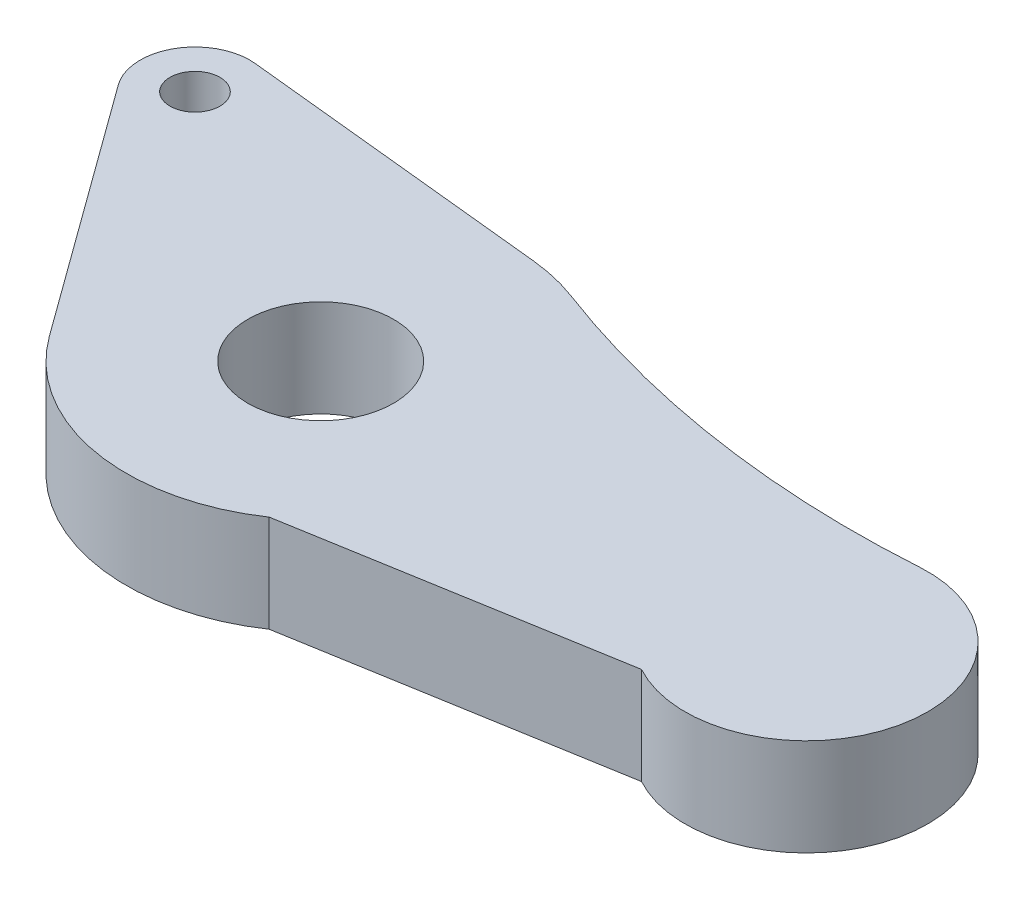
ISO-10303-21;
HEADER;
FILE_DESCRIPTION(('STEP AP214'),'2;1');
FILE_NAME('part.step','',(''),(''),'','','');
FILE_SCHEMA(('AUTOMOTIVE_DESIGN { 1 0 10303 214 1 1 1 1 }'));
ENDSEC;
DATA;
#1=APPLICATION_CONTEXT('core data for automotive mechanical design processes');
#2=APPLICATION_PROTOCOL_DEFINITION('international standard','automotive_design',2000,#1);
#3=PRODUCT_CONTEXT('',#1,'mechanical');
#4=PRODUCT('Part','Part','',(#3));
#5=PRODUCT_RELATED_PRODUCT_CATEGORY('part','',(#4));
#6=PRODUCT_DEFINITION_FORMATION('','',#4);
#7=PRODUCT_DEFINITION_CONTEXT('part definition',#1,'design');
#8=PRODUCT_DEFINITION('design','',#6,#7);
#9=PRODUCT_DEFINITION_SHAPE('','',#8);
#10=(LENGTH_UNIT() NAMED_UNIT(*) SI_UNIT(.MILLI.,.METRE.));
#11=(NAMED_UNIT(*) PLANE_ANGLE_UNIT() SI_UNIT($,.RADIAN.));
#12=(NAMED_UNIT(*) SI_UNIT($,.STERADIAN.) SOLID_ANGLE_UNIT());
#13=UNCERTAINTY_MEASURE_WITH_UNIT(LENGTH_MEASURE(1.E-05),#10,'distance_accuracy_value','');
#14=(GEOMETRIC_REPRESENTATION_CONTEXT(3) GLOBAL_UNCERTAINTY_ASSIGNED_CONTEXT((#13)) GLOBAL_UNIT_ASSIGNED_CONTEXT((#10,
#11,#12)) REPRESENTATION_CONTEXT('',''));
#15=CARTESIAN_POINT('',(0.,0.,0.));
#16=DIRECTION('',(0.,0.,1.));
#17=DIRECTION('',(1.,0.,0.));
#18=AXIS2_PLACEMENT_3D('',#15,#16,#17);
#19=CARTESIAN_POINT('',(0.,2.,0.));
#20=DIRECTION('',(0.,-1.,0.));
#21=DIRECTION('',(0.,0.,-1.));
#22=AXIS2_PLACEMENT_3D('',#19,#20,#21);
#23=CYLINDRICAL_SURFACE('',#22,4.);
#24=DIRECTION('',(0.,1.,0.));
#25=VECTOR('',#24,1.);
#26=CARTESIAN_POINT('',(0.408466300966631,-10.3550195170832,-3.97908975533031));
#27=LINE('',#26,#25);
#28=CARTESIAN_POINT('',(0.40846630096663,0.,-3.97908975533031));
#29=VERTEX_POINT('',#28);
#30=CARTESIAN_POINT('',(0.408466300966631,2.,-3.97908975533031));
#31=VERTEX_POINT('',#30);
#32=EDGE_CURVE('E56',#29,#31,#27,.T.);
#33=ORIENTED_EDGE('',*,*,#32,.T.);
#34=CARTESIAN_POINT('',(0.,2.,0.));
#35=DIRECTION('',(0.,1.,0.));
#36=DIRECTION('',(0.,0.,1.));
#37=AXIS2_PLACEMENT_3D('',#34,#35,#36);
#38=CIRCLE('',#37,4.);
#39=CARTESIAN_POINT('',(1.41458333333333,2.,-3.74151760560545));
#40=VERTEX_POINT('',#39);
#41=EDGE_CURVE('E145',#40,#31,#38,.T.);
#42=ORIENTED_EDGE('',*,*,#41,.F.);
#43=DIRECTION('',(0.,-1.,0.));
#44=VECTOR('',#43,1.);
#45=CARTESIAN_POINT('',(1.41458333333333,2.,-3.74151760560545));
#46=LINE('',#45,#44);
#47=CARTESIAN_POINT('',(1.41458333333333,0.,-3.74151760560545));
#48=VERTEX_POINT('',#47);
#49=EDGE_CURVE('E153',#40,#48,#46,.T.);
#50=ORIENTED_EDGE('',*,*,#49,.T.);
#51=CARTESIAN_POINT('',(0.,0.,0.));
#52=DIRECTION('',(0.,1.,0.));
#53=DIRECTION('',(0.,0.,1.));
#54=AXIS2_PLACEMENT_3D('',#51,#52,#53);
#55=CIRCLE('',#54,4.);
#56=EDGE_CURVE('E154',#48,#29,#55,.T.);
#57=ORIENTED_EDGE('',*,*,#56,.T.);
#58=EDGE_LOOP('',(#33,#42,#50,#57));
#59=FACE_BOUND('',#58,.T.);
#60=ADVANCED_FACE('F33',(#59),#23,.T.);
#61=CARTESIAN_POINT('',(0.,2.,0.));
#62=DIRECTION('',(0.,1.,0.));
#63=DIRECTION('',(0.,0.,1.));
#64=AXIS2_PLACEMENT_3D('',#61,#62,#63);
#65=PLANE('',#64);
#66=ORIENTED_EDGE('',*,*,#41,.T.);
#67=DIRECTION('',(-0.994772438832578,0.,-0.102116575241658));
#68=VECTOR('',#67,1.);
#69=CARTESIAN_POINT('',(-5.98414407196677,2.,-4.63531167368618));
#70=LINE('',#69,#68);
#71=CARTESIAN_POINT('',(-5.98414407196677,2.,-4.63531167368618));
#72=VERTEX_POINT('',#71);
#73=EDGE_CURVE('E112',#31,#72,#70,.T.);
#74=ORIENTED_EDGE('',*,*,#73,.T.);
#75=CARTESIAN_POINT('',(-6.09949561710737,2.,-3.51161028034161));
#76=DIRECTION('',(0.,1.,0.));
#77=DIRECTION('',(0.,0.,1.));
#78=AXIS2_PLACEMENT_3D('',#75,#76,#77);
#79=CIRCLE('',#78,1.12960648031553);
#80=CARTESIAN_POINT('',(-7.01335309100463,2.,-2.8476258544904));
#81=VERTEX_POINT('',#80);
#82=EDGE_CURVE('E106',#72,#81,#79,.T.);
#83=ORIENTED_EDGE('',*,*,#82,.T.);
#84=DIRECTION('',(0.587801537457314,0.,0.809005162259684));
#85=VECTOR('',#84,1.);
#86=CARTESIAN_POINT('',(-7.01335309100463,2.,-2.8476258544904));
#87=LINE('',#86,#85);
#88=CARTESIAN_POINT('',(-3.23602064903874,2.,2.35120614982926));
#89=VERTEX_POINT('',#88);
#90=EDGE_CURVE('E115',#81,#89,#87,.T.);
#91=ORIENTED_EDGE('',*,*,#90,.T.);
#92=CARTESIAN_POINT('',(2.24792213296292,2.,3.30860183221485));
#93=VERTEX_POINT('',#92);
#94=EDGE_CURVE('E48',#89,#93,#38,.T.);
#95=ORIENTED_EDGE('',*,*,#94,.T.);
#96=DIRECTION('',(0.985747988526401,0.,-0.168228722625341));
#97=VECTOR('',#96,1.);
#98=CARTESIAN_POINT('',(2.24792213296292,2.,3.30860183221485));
#99=LINE('',#98,#97);
#100=CARTESIAN_POINT('',(8.79617017612445,2.,2.19107137153215));
#101=VERTEX_POINT('',#100);
#102=EDGE_CURVE('E147',#93,#101,#99,.T.);
#103=ORIENTED_EDGE('',*,*,#102,.T.);
#104=CARTESIAN_POINT('',(10.,2.,0.));
#105=DIRECTION('',(0.,1.,0.));
#106=DIRECTION('',(0.,0.,1.));
#107=AXIS2_PLACEMENT_3D('',#104,#105,#106);
#108=CIRCLE('',#107,2.5);
#109=CARTESIAN_POINT('',(9.83194444444445,2.,-2.49434507040364));
#110=VERTEX_POINT('',#109);
#111=EDGE_CURVE('E149',#101,#110,#108,.T.);
#112=ORIENTED_EDGE('',*,*,#111,.T.);
#113=CARTESIAN_POINT('',(8.4875,2.,-22.4491056336327));
#114=DIRECTION('',(0.,-1.,0.));
#115=DIRECTION('',(0.,0.,1.));
#116=AXIS2_PLACEMENT_3D('',#113,#114,#115);
#117=CIRCLE('',#116,20.);
#118=EDGE_CURVE('E151',#110,#40,#117,.T.);
#119=ORIENTED_EDGE('',*,*,#118,.T.);
#120=EDGE_LOOP('',(#66,#74,#83,#91,#95,#103,#112,#119));
#121=FACE_BOUND('',#120,.T.);
#122=CARTESIAN_POINT('',(0.,2.,0.));
#123=DIRECTION('',(0.,1.,0.));
#124=DIRECTION('',(0.,0.,1.));
#125=AXIS2_PLACEMENT_3D('',#122,#123,#124);
#126=CIRCLE('',#125,1.5);
#127=CARTESIAN_POINT('',(0.,2.,1.5));
#128=VERTEX_POINT('',#127);
#129=EDGE_CURVE('E139',#128,#128,#126,.T.);
#130=ORIENTED_EDGE('',*,*,#129,.F.);
#131=EDGE_LOOP('',(#130));
#132=FACE_BOUND('',#131,.T.);
#133=CARTESIAN_POINT('',(-6.09949561710737,2.,-3.51161028034161));
#134=DIRECTION('',(0.,1.,0.));
#135=DIRECTION('',(0.,0.,1.));
#136=AXIS2_PLACEMENT_3D('',#133,#134,#135);
#137=CIRCLE('',#136,0.514521652797306);
#138=CARTESIAN_POINT('',(-6.09949561710737,2.,-2.9970886275443));
#139=VERTEX_POINT('',#138);
#140=EDGE_CURVE('E122',#139,#139,#137,.T.);
#141=ORIENTED_EDGE('',*,*,#140,.F.);
#142=EDGE_LOOP('',(#141));
#143=FACE_BOUND('',#142,.T.);
#144=ADVANCED_FACE('F119',(#121,#132,#143),#65,.T.);
#145=CARTESIAN_POINT('',(0.,0.,0.));
#146=DIRECTION('',(0.,1.,0.));
#147=DIRECTION('',(0.,0.,1.));
#148=AXIS2_PLACEMENT_3D('',#145,#146,#147);
#149=PLANE('',#148);
#150=ORIENTED_EDGE('',*,*,#56,.F.);
#151=CARTESIAN_POINT('',(8.4875,0.,-22.4491056336327));
#152=DIRECTION('',(0.,-1.,0.));
#153=DIRECTION('',(0.,0.,1.));
#154=AXIS2_PLACEMENT_3D('',#151,#152,#153);
#155=CIRCLE('',#154,20.);
#156=CARTESIAN_POINT('',(9.83194444444445,0.,-2.49434507040364));
#157=VERTEX_POINT('',#156);
#158=EDGE_CURVE('E160',#157,#48,#155,.T.);
#159=ORIENTED_EDGE('',*,*,#158,.F.);
#160=CARTESIAN_POINT('',(10.,0.,0.));
#161=DIRECTION('',(0.,1.,0.));
#162=DIRECTION('',(0.,0.,1.));
#163=AXIS2_PLACEMENT_3D('',#160,#161,#162);
#164=CIRCLE('',#163,2.5);
#165=CARTESIAN_POINT('',(8.79617017612445,0.,2.19107137153215));
#166=VERTEX_POINT('',#165);
#167=EDGE_CURVE('E158',#166,#157,#164,.T.);
#168=ORIENTED_EDGE('',*,*,#167,.F.);
#169=DIRECTION('',(0.985747988526401,0.,-0.168228722625341));
#170=VECTOR('',#169,1.);
#171=CARTESIAN_POINT('',(2.24792213296292,0.,3.30860183221485));
#172=LINE('',#171,#170);
#173=CARTESIAN_POINT('',(2.24792213296292,0.,3.30860183221485));
#174=VERTEX_POINT('',#173);
#175=EDGE_CURVE('E156',#174,#166,#172,.T.);
#176=ORIENTED_EDGE('',*,*,#175,.F.);
#177=CARTESIAN_POINT('',(-3.23602064903874,0.,2.35120614982926));
#178=VERTEX_POINT('',#177);
#179=EDGE_CURVE('E142',#178,#174,#55,.T.);
#180=ORIENTED_EDGE('',*,*,#179,.F.);
#181=DIRECTION('',(-0.587801537457315,0.,-0.809005162259684));
#182=VECTOR('',#181,1.);
#183=CARTESIAN_POINT('',(-7.01335309100463,0.,-2.8476258544904));
#184=LINE('',#183,#182);
#185=CARTESIAN_POINT('',(-7.01335309100463,0.,-2.8476258544904));
#186=VERTEX_POINT('',#185);
#187=EDGE_CURVE('E138',#178,#186,#184,.T.);
#188=ORIENTED_EDGE('',*,*,#187,.T.);
#189=CARTESIAN_POINT('',(-6.09949561710737,0.,-3.51161028034161));
#190=DIRECTION('',(0.,1.,0.));
#191=DIRECTION('',(0.,0.,1.));
#192=AXIS2_PLACEMENT_3D('',#189,#190,#191);
#193=CIRCLE('',#192,1.12960648031553);
#194=CARTESIAN_POINT('',(-5.98414407196677,0.,-4.63531167368618));
#195=VERTEX_POINT('',#194);
#196=EDGE_CURVE('E108',#186,#195,#193,.F.);
#197=ORIENTED_EDGE('',*,*,#196,.T.);
#198=DIRECTION('',(0.994772438832578,0.,0.102116575241658));
#199=VECTOR('',#198,1.);
#200=CARTESIAN_POINT('',(-5.98414407196677,0.,-4.63531167368618));
#201=LINE('',#200,#199);
#202=EDGE_CURVE('E131',#195,#29,#201,.T.);
#203=ORIENTED_EDGE('',*,*,#202,.T.);
#204=EDGE_LOOP('',(#150,#159,#168,#176,#180,#188,#197,#203));
#205=FACE_BOUND('',#204,.T.);
#206=CARTESIAN_POINT('',(0.,0.,0.));
#207=DIRECTION('',(0.,1.,0.));
#208=DIRECTION('',(0.,0.,1.));
#209=AXIS2_PLACEMENT_3D('',#206,#207,#208);
#210=CIRCLE('',#209,1.5);
#211=CARTESIAN_POINT('',(0.,0.,1.5));
#212=VERTEX_POINT('',#211);
#213=EDGE_CURVE('E137',#212,#212,#210,.T.);
#214=ORIENTED_EDGE('',*,*,#213,.T.);
#215=EDGE_LOOP('',(#214));
#216=FACE_BOUND('',#215,.T.);
#217=CARTESIAN_POINT('',(-6.09949561710737,0.,-3.51161028034161));
#218=DIRECTION('',(0.,1.,0.));
#219=DIRECTION('',(0.,0.,1.));
#220=AXIS2_PLACEMENT_3D('',#217,#218,#219);
#221=CIRCLE('',#220,0.514521652797306);
#222=CARTESIAN_POINT('',(-6.09949561710737,0.,-2.9970886275443));
#223=VERTEX_POINT('',#222);
#224=EDGE_CURVE('E134',#223,#223,#221,.F.);
#225=ORIENTED_EDGE('',*,*,#224,.F.);
#226=EDGE_LOOP('',(#225));
#227=FACE_BOUND('',#226,.T.);
#228=ADVANCED_FACE('F179',(#205,#216,#227),#149,.F.);
#229=ORIENTED_EDGE('',*,*,#94,.F.);
#230=DIRECTION('',(0.,1.,0.));
#231=VECTOR('',#230,1.);
#232=CARTESIAN_POINT('',(-3.23602064903874,-10.3550195170832,2.35120614982926));
#233=LINE('',#232,#231);
#234=EDGE_CURVE('E111',#178,#89,#233,.T.);
#235=ORIENTED_EDGE('',*,*,#234,.F.);
#236=ORIENTED_EDGE('',*,*,#179,.T.);
#237=DIRECTION('',(0.,-1.,0.));
#238=VECTOR('',#237,1.);
#239=CARTESIAN_POINT('',(2.24792213296292,2.,3.30860183221485));
#240=LINE('',#239,#238);
#241=EDGE_CURVE('E11',#93,#174,#240,.T.);
#242=ORIENTED_EDGE('',*,*,#241,.F.);
#243=EDGE_LOOP('',(#229,#235,#236,#242));
#244=FACE_BOUND('',#243,.T.);
#245=ADVANCED_FACE('F35',(#244),#23,.T.);
#246=CARTESIAN_POINT('',(2.24792213296292,2.,3.30860183221485));
#247=DIRECTION('',(-0.168228722625341,0.,-0.985747988526401));
#248=DIRECTION('',(-0.985747988526401,0.,0.168228722625341));
#249=AXIS2_PLACEMENT_3D('',#246,#247,#248);
#250=PLANE('',#249);
#251=ORIENTED_EDGE('',*,*,#175,.T.);
#252=DIRECTION('',(0.,-1.,0.));
#253=VECTOR('',#252,1.);
#254=CARTESIAN_POINT('',(8.79617017612445,2.,2.19107137153215));
#255=LINE('',#254,#253);
#256=EDGE_CURVE('E41',#101,#166,#255,.T.);
#257=ORIENTED_EDGE('',*,*,#256,.F.);
#258=ORIENTED_EDGE('',*,*,#102,.F.);
#259=ORIENTED_EDGE('',*,*,#241,.T.);
#260=EDGE_LOOP('',(#251,#257,#258,#259));
#261=FACE_BOUND('',#260,.T.);
#262=ADVANCED_FACE('F192',(#261),#250,.F.);
#263=CARTESIAN_POINT('',(10.,2.,0.));
#264=DIRECTION('',(0.,-1.,0.));
#265=DIRECTION('',(0.,0.,-1.));
#266=AXIS2_PLACEMENT_3D('',#263,#264,#265);
#267=CYLINDRICAL_SURFACE('',#266,2.5);
#268=ORIENTED_EDGE('',*,*,#167,.T.);
#269=DIRECTION('',(0.,-1.,0.));
#270=VECTOR('',#269,1.);
#271=CARTESIAN_POINT('',(9.83194444444445,2.,-2.49434507040364));
#272=LINE('',#271,#270);
#273=EDGE_CURVE('E164',#110,#157,#272,.T.);
#274=ORIENTED_EDGE('',*,*,#273,.F.);
#275=ORIENTED_EDGE('',*,*,#111,.F.);
#276=ORIENTED_EDGE('',*,*,#256,.T.);
#277=EDGE_LOOP('',(#268,#274,#275,#276));
#278=FACE_BOUND('',#277,.T.);
#279=ADVANCED_FACE('F171',(#278),#267,.T.);
#280=CARTESIAN_POINT('',(8.4875,2.,-22.4491056336327));
#281=DIRECTION('',(0.,-1.,0.));
#282=DIRECTION('',(0.,0.,-1.));
#283=AXIS2_PLACEMENT_3D('',#280,#281,#282);
#284=CYLINDRICAL_SURFACE('',#283,20.);
#285=ORIENTED_EDGE('',*,*,#158,.T.);
#286=ORIENTED_EDGE('',*,*,#49,.F.);
#287=ORIENTED_EDGE('',*,*,#118,.F.);
#288=ORIENTED_EDGE('',*,*,#273,.T.);
#289=EDGE_LOOP('',(#285,#286,#287,#288));
#290=FACE_BOUND('',#289,.T.);
#291=ADVANCED_FACE('F184',(#290),#284,.F.);
#292=CARTESIAN_POINT('',(0.,2.,0.));
#293=DIRECTION('',(0.,-1.,0.));
#294=DIRECTION('',(0.,0.,-1.));
#295=AXIS2_PLACEMENT_3D('',#292,#293,#294);
#296=CYLINDRICAL_SURFACE('',#295,1.5);
#297=ORIENTED_EDGE('',*,*,#129,.T.);
#298=EDGE_LOOP('',(#297));
#299=FACE_BOUND('',#298,.T.);
#300=ORIENTED_EDGE('',*,*,#213,.F.);
#301=EDGE_LOOP('',(#300));
#302=FACE_BOUND('',#301,.T.);
#303=ADVANCED_FACE('F206',(#299,#302),#296,.F.);
#304=CARTESIAN_POINT('',(-7.01335309100463,-10.3550195170832,-2.8476258544904));
#305=DIRECTION('',(-0.809005162259684,0.,0.587801537457314));
#306=DIRECTION('',(0.587801537457315,0.,0.809005162259684));
#307=AXIS2_PLACEMENT_3D('',#304,#305,#306);
#308=PLANE('',#307);
#309=ORIENTED_EDGE('',*,*,#187,.F.);
#310=ORIENTED_EDGE('',*,*,#234,.T.);
#311=ORIENTED_EDGE('',*,*,#90,.F.);
#312=DIRECTION('',(0.,1.,0.));
#313=VECTOR('',#312,1.);
#314=CARTESIAN_POINT('',(-7.01335309100463,-10.3550195170832,-2.8476258544904));
#315=LINE('',#314,#313);
#316=EDGE_CURVE('E101',#186,#81,#315,.T.);
#317=ORIENTED_EDGE('',*,*,#316,.F.);
#318=EDGE_LOOP('',(#309,#310,#311,#317));
#319=FACE_BOUND('',#318,.T.);
#320=ADVANCED_FACE('F116',(#319),#308,.T.);
#321=CARTESIAN_POINT('',(-5.98414407196677,-10.3550195170832,-4.63531167368618));
#322=DIRECTION('',(0.102116575241658,0.,-0.994772438832578));
#323=DIRECTION('',(-0.994772438832578,0.,-0.102116575241658));
#324=AXIS2_PLACEMENT_3D('',#321,#322,#323);
#325=PLANE('',#324);
#326=ORIENTED_EDGE('',*,*,#202,.F.);
#327=DIRECTION('',(0.,1.,0.));
#328=VECTOR('',#327,1.);
#329=CARTESIAN_POINT('',(-5.98414407196677,-10.3550195170832,-4.63531167368618));
#330=LINE('',#329,#328);
#331=EDGE_CURVE('E129',#195,#72,#330,.T.);
#332=ORIENTED_EDGE('',*,*,#331,.T.);
#333=ORIENTED_EDGE('',*,*,#73,.F.);
#334=ORIENTED_EDGE('',*,*,#32,.F.);
#335=EDGE_LOOP('',(#326,#332,#333,#334));
#336=FACE_BOUND('',#335,.T.);
#337=ADVANCED_FACE('F188',(#336),#325,.T.);
#338=CARTESIAN_POINT('',(-6.09949561710737,-10.3550195170832,-3.51161028034161));
#339=DIRECTION('',(0.,1.,0.));
#340=DIRECTION('',(0.,0.,1.));
#341=AXIS2_PLACEMENT_3D('',#338,#339,#340);
#342=CYLINDRICAL_SURFACE('',#341,1.12960648031553);
#343=ORIENTED_EDGE('',*,*,#196,.F.);
#344=ORIENTED_EDGE('',*,*,#316,.T.);
#345=ORIENTED_EDGE('',*,*,#82,.F.);
#346=ORIENTED_EDGE('',*,*,#331,.F.);
#347=EDGE_LOOP('',(#343,#344,#345,#346));
#348=FACE_BOUND('',#347,.T.);
#349=ADVANCED_FACE('F103',(#348),#342,.T.);
#350=CARTESIAN_POINT('',(-6.09949561710737,-10.3550195170832,-3.51161028034161));
#351=DIRECTION('',(0.,1.,0.));
#352=DIRECTION('',(0.,0.,1.));
#353=AXIS2_PLACEMENT_3D('',#350,#351,#352);
#354=CYLINDRICAL_SURFACE('',#353,0.514521652797306);
#355=ORIENTED_EDGE('',*,*,#224,.T.);
#356=EDGE_LOOP('',(#355));
#357=FACE_BOUND('',#356,.T.);
#358=ORIENTED_EDGE('',*,*,#140,.T.);
#359=EDGE_LOOP('',(#358));
#360=FACE_BOUND('',#359,.T.);
#361=ADVANCED_FACE('F244',(#357,#360),#354,.F.);
#362=CLOSED_SHELL('',(#60,#144,#228,#245,#262,#279,#291,#303,#320,#337,#349,#361));
#363=MANIFOLD_SOLID_BREP('B2',#362);
#364=ADVANCED_BREP_SHAPE_REPRESENTATION('',(#18,#363),#14);
#365=SHAPE_DEFINITION_REPRESENTATION(#9,#364);
ENDSEC;
END-ISO-10303-21;
